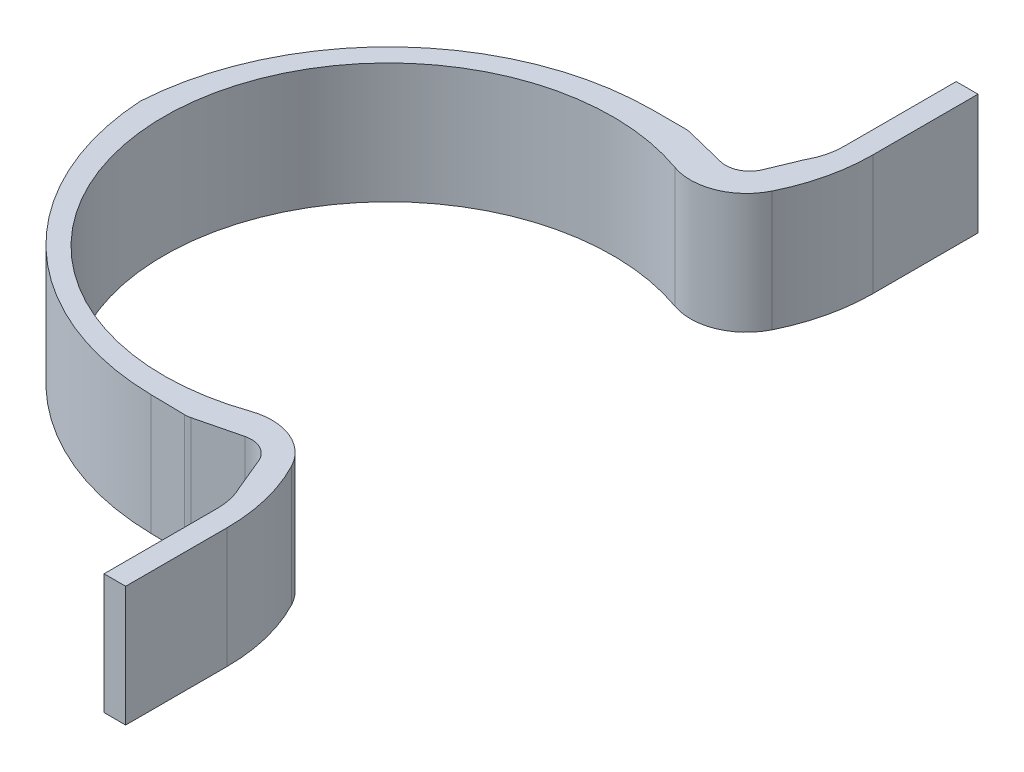
ISO-10303-21;
HEADER;
FILE_DESCRIPTION(('STEP AP214'),'2;1');
FILE_NAME('part.step','',(''),(''),'','','');
FILE_SCHEMA(('AUTOMOTIVE_DESIGN { 1 0 10303 214 1 1 1 1 }'));
ENDSEC;
DATA;
#1=APPLICATION_CONTEXT('core data for automotive mechanical design processes');
#2=APPLICATION_PROTOCOL_DEFINITION('international standard','automotive_design',2000,#1);
#3=PRODUCT_CONTEXT('',#1,'mechanical');
#4=PRODUCT('Part','Part','',(#3));
#5=PRODUCT_RELATED_PRODUCT_CATEGORY('part','',(#4));
#6=PRODUCT_DEFINITION_FORMATION('','',#4);
#7=PRODUCT_DEFINITION_CONTEXT('part definition',#1,'design');
#8=PRODUCT_DEFINITION('design','',#6,#7);
#9=PRODUCT_DEFINITION_SHAPE('','',#8);
#10=(LENGTH_UNIT() NAMED_UNIT(*) SI_UNIT(.MILLI.,.METRE.));
#11=(NAMED_UNIT(*) PLANE_ANGLE_UNIT() SI_UNIT($,.RADIAN.));
#12=(NAMED_UNIT(*) SI_UNIT($,.STERADIAN.) SOLID_ANGLE_UNIT());
#13=UNCERTAINTY_MEASURE_WITH_UNIT(LENGTH_MEASURE(1.E-05),#10,'distance_accuracy_value','');
#14=(GEOMETRIC_REPRESENTATION_CONTEXT(3) GLOBAL_UNCERTAINTY_ASSIGNED_CONTEXT((#13)) GLOBAL_UNIT_ASSIGNED_CONTEXT((#10,
#11,#12)) REPRESENTATION_CONTEXT('',''));
#15=CARTESIAN_POINT('',(0.,0.,0.));
#16=DIRECTION('',(0.,0.,1.));
#17=DIRECTION('',(1.,0.,0.));
#18=AXIS2_PLACEMENT_3D('',#15,#16,#17);
#19=CARTESIAN_POINT('',(-4.1408278836324,15.,-6.3209009215396));
#20=DIRECTION('',(0.,-1.,0.));
#21=DIRECTION('',(0.,0.,-1.));
#22=AXIS2_PLACEMENT_3D('',#19,#20,#21);
#23=CYLINDRICAL_SURFACE('',#22,28.);
#24=CARTESIAN_POINT('',(-4.1408278836324,15.,-6.3209009215396));
#25=DIRECTION('',(0.,1.,0.));
#26=DIRECTION('',(0.,0.,1.));
#27=AXIS2_PLACEMENT_3D('',#24,#25,#26);
#28=CIRCLE('',#27,28.);
#29=CARTESIAN_POINT('',(5.21689190636003,15.,-32.7109194954623));
#30=VERTEX_POINT('',#29);
#31=CARTESIAN_POINT('',(5.07458694263335,15.,20.1191469146471));
#32=VERTEX_POINT('',#31);
#33=EDGE_CURVE('E250',#30,#32,#28,.T.);
#34=ORIENTED_EDGE('',*,*,#33,.T.);
#35=DIRECTION('',(0.,-1.,0.));
#36=VECTOR('',#35,1.);
#37=CARTESIAN_POINT('',(5.07458694263335,15.,20.1191469146471));
#38=LINE('',#37,#36);
#39=CARTESIAN_POINT('',(5.07458694263335,0.,20.1191469146471));
#40=VERTEX_POINT('',#39);
#41=EDGE_CURVE('E67',#32,#40,#38,.T.);
#42=ORIENTED_EDGE('',*,*,#41,.T.);
#43=CARTESIAN_POINT('',(-4.1408278836324,0.,-6.3209009215396));
#44=DIRECTION('',(0.,1.,0.));
#45=DIRECTION('',(0.,0.,1.));
#46=AXIS2_PLACEMENT_3D('',#43,#44,#45);
#47=CIRCLE('',#46,28.);
#48=CARTESIAN_POINT('',(5.21689190636003,0.,-32.7109194954623));
#49=VERTEX_POINT('',#48);
#50=EDGE_CURVE('E278',#49,#40,#47,.T.);
#51=ORIENTED_EDGE('',*,*,#50,.F.);
#52=DIRECTION('',(0.,-1.,0.));
#53=VECTOR('',#52,1.);
#54=CARTESIAN_POINT('',(5.21689190636003,15.,-32.7109194954623));
#55=LINE('',#54,#53);
#56=EDGE_CURVE('E465',#49,#30,#55,.F.);
#57=ORIENTED_EDGE('',*,*,#56,.T.);
#58=EDGE_LOOP('',(#34,#42,#51,#57));
#59=FACE_BOUND('',#58,.T.);
#60=ADVANCED_FACE('F43',(#59),#23,.F.);
#61=CARTESIAN_POINT('',(16.2165948188573,15.,0.));
#62=DIRECTION('',(1.,0.,0.));
#63=DIRECTION('',(0.,0.,-1.));
#64=AXIS2_PLACEMENT_3D('',#61,#62,#63);
#65=PLANE('',#64);
#66=DIRECTION('',(0.,0.,1.));
#67=VECTOR('',#66,1.);
#68=CARTESIAN_POINT('',(16.2165948188573,15.,0.));
#69=LINE('',#68,#67);
#70=CARTESIAN_POINT('',(16.2165948188573,15.,-59.5259412203661));
#71=VERTEX_POINT('',#70);
#72=CARTESIAN_POINT('',(16.2165948188573,15.,-46.4057636800432));
#73=VERTEX_POINT('',#72);
#74=EDGE_CURVE('E229',#71,#73,#69,.T.);
#75=ORIENTED_EDGE('',*,*,#74,.T.);
#76=DIRECTION('',(0.,-1.,0.));
#77=VECTOR('',#76,1.);
#78=CARTESIAN_POINT('',(16.2165948188573,0.,-46.4057636800432));
#79=LINE('',#78,#77);
#80=CARTESIAN_POINT('',(16.2165948188573,0.,-46.4057636800432));
#81=VERTEX_POINT('',#80);
#82=EDGE_CURVE('E364',#73,#81,#79,.T.);
#83=ORIENTED_EDGE('',*,*,#82,.T.);
#84=DIRECTION('',(0.,0.,1.));
#85=VECTOR('',#84,1.);
#86=CARTESIAN_POINT('',(16.2165948188573,0.,0.));
#87=LINE('',#86,#85);
#88=CARTESIAN_POINT('',(16.2165948188573,0.,-59.5259412203661));
#89=VERTEX_POINT('',#88);
#90=EDGE_CURVE('E232',#89,#81,#87,.T.);
#91=ORIENTED_EDGE('',*,*,#90,.F.);
#92=DIRECTION('',(0.,-1.,0.));
#93=VECTOR('',#92,1.);
#94=CARTESIAN_POINT('',(16.2165948188573,15.,-59.5259412203661));
#95=LINE('',#94,#93);
#96=EDGE_CURVE('E226',#71,#89,#95,.T.);
#97=ORIENTED_EDGE('',*,*,#96,.F.);
#98=EDGE_LOOP('',(#75,#83,#91,#97));
#99=FACE_BOUND('',#98,.T.);
#100=ADVANCED_FACE('F228',(#99),#65,.T.);
#101=CARTESIAN_POINT('',(0.,15.,-59.5259412203661));
#102=DIRECTION('',(0.,0.,-1.));
#103=DIRECTION('',(-1.,0.,0.));
#104=AXIS2_PLACEMENT_3D('',#101,#102,#103);
#105=PLANE('',#104);
#106=DIRECTION('',(1.,0.,0.));
#107=VECTOR('',#106,1.);
#108=CARTESIAN_POINT('',(0.,0.,-59.5259412203661));
#109=LINE('',#108,#107);
#110=CARTESIAN_POINT('',(13.4971054403081,0.,-59.5259412203661));
#111=VERTEX_POINT('',#110);
#112=EDGE_CURVE('E284',#111,#89,#109,.T.);
#113=ORIENTED_EDGE('',*,*,#112,.F.);
#114=DIRECTION('',(0.,-1.,0.));
#115=VECTOR('',#114,1.);
#116=CARTESIAN_POINT('',(13.4971054403081,15.,-59.5259412203661));
#117=LINE('',#116,#115);
#118=CARTESIAN_POINT('',(13.4971054403081,15.,-59.5259412203661));
#119=VERTEX_POINT('',#118);
#120=EDGE_CURVE('E239',#119,#111,#117,.T.);
#121=ORIENTED_EDGE('',*,*,#120,.F.);
#122=DIRECTION('',(1.,0.,0.));
#123=VECTOR('',#122,1.);
#124=CARTESIAN_POINT('',(0.,15.,-59.5259412203661));
#125=LINE('',#124,#123);
#126=EDGE_CURVE('E246',#119,#71,#125,.T.);
#127=ORIENTED_EDGE('',*,*,#126,.T.);
#128=ORIENTED_EDGE('',*,*,#96,.T.);
#129=EDGE_LOOP('',(#113,#121,#127,#128));
#130=FACE_BOUND('',#129,.T.);
#131=ADVANCED_FACE('F254',(#130),#105,.T.);
#132=CARTESIAN_POINT('',(13.4971054403081,15.,0.));
#133=DIRECTION('',(-1.,0.,0.));
#134=DIRECTION('',(0.,0.,1.));
#135=AXIS2_PLACEMENT_3D('',#132,#133,#134);
#136=PLANE('',#135);
#137=CARTESIAN_POINT('',(13.4971054403081,7.42210730440718,-52.5898544294883));
#138=DIRECTION('',(-1.,0.,0.));
#139=DIRECTION('',(0.,0.,1.));
#140=AXIS2_PLACEMENT_3D('',#137,#138,#139);
#141=CIRCLE('',#140,3.00628595033639);
#142=CARTESIAN_POINT('',(13.4971054403081,7.42210730440718,-49.5835684791519));
#143=VERTEX_POINT('',#142);
#144=EDGE_CURVE('E604',#143,#143,#141,.T.);
#145=ORIENTED_EDGE('',*,*,#144,.F.);
#146=EDGE_LOOP('',(#145));
#147=FACE_BOUND('',#146,.T.);
#148=DIRECTION('',(0.,0.,-1.));
#149=VECTOR('',#148,1.);
#150=CARTESIAN_POINT('',(13.4971054403081,0.,0.));
#151=LINE('',#150,#149);
#152=CARTESIAN_POINT('',(13.4971054403081,0.,-45.5259412203661));
#153=VERTEX_POINT('',#152);
#154=EDGE_CURVE('E288',#153,#111,#151,.T.);
#155=ORIENTED_EDGE('',*,*,#154,.F.);
#156=DIRECTION('',(0.,-1.,0.));
#157=VECTOR('',#156,1.);
#158=CARTESIAN_POINT('',(13.4971054403081,15.,-45.5259412203661));
#159=LINE('',#158,#157);
#160=CARTESIAN_POINT('',(13.4971054403081,15.,-45.5259412203661));
#161=VERTEX_POINT('',#160);
#162=EDGE_CURVE('E334',#153,#161,#159,.F.);
#163=ORIENTED_EDGE('',*,*,#162,.T.);
#164=DIRECTION('',(0.,0.,-1.));
#165=VECTOR('',#164,1.);
#166=CARTESIAN_POINT('',(13.4971054403081,15.,0.));
#167=LINE('',#166,#165);
#168=EDGE_CURVE('E257',#161,#119,#167,.T.);
#169=ORIENTED_EDGE('',*,*,#168,.T.);
#170=ORIENTED_EDGE('',*,*,#120,.T.);
#171=EDGE_LOOP('',(#155,#163,#169,#170));
#172=FACE_BOUND('',#171,.T.);
#173=ADVANCED_FACE('F581',(#147,#172),#136,.T.);
#174=CARTESIAN_POINT('',(0.,15.,-37.5259412203661));
#175=DIRECTION('',(0.,0.,-1.));
#176=DIRECTION('',(-1.,0.,0.));
#177=AXIS2_PLACEMENT_3D('',#174,#175,#176);
#178=PLANE('',#177);
#179=DIRECTION('',(1.,0.,0.));
#180=VECTOR('',#179,1.);
#181=CARTESIAN_POINT('',(0.,15.,-37.5259412203661));
#182=LINE('',#181,#180);
#183=CARTESIAN_POINT('',(-2.34543573547922,15.,-37.5259412203661));
#184=VERTEX_POINT('',#183);
#185=CARTESIAN_POINT('',(1.65692417209445,15.,-37.5259412203661));
#186=VERTEX_POINT('',#185);
#187=EDGE_CURVE('E260',#184,#186,#182,.T.);
#188=ORIENTED_EDGE('',*,*,#187,.T.);
#189=DIRECTION('',(0.,1.,0.));
#190=VECTOR('',#189,1.);
#191=CARTESIAN_POINT('',(1.65692417209445,0.,-37.5259412203661));
#192=LINE('',#191,#190);
#193=CARTESIAN_POINT('',(1.65692417209445,0.,-37.5259412203661));
#194=VERTEX_POINT('',#193);
#195=EDGE_CURVE('E419',#186,#194,#192,.F.);
#196=ORIENTED_EDGE('',*,*,#195,.T.);
#197=DIRECTION('',(1.,0.,0.));
#198=VECTOR('',#197,1.);
#199=CARTESIAN_POINT('',(0.,0.,-37.5259412203661));
#200=LINE('',#199,#198);
#201=CARTESIAN_POINT('',(-2.34543573547922,0.,-37.5259412203661));
#202=VERTEX_POINT('',#201);
#203=EDGE_CURVE('E291',#202,#194,#200,.T.);
#204=ORIENTED_EDGE('',*,*,#203,.F.);
#205=DIRECTION('',(0.,-1.,0.));
#206=VECTOR('',#205,1.);
#207=CARTESIAN_POINT('',(-2.34543573547922,15.,-37.5259412203661));
#208=LINE('',#207,#206);
#209=EDGE_CURVE('E331',#202,#184,#208,.F.);
#210=ORIENTED_EDGE('',*,*,#209,.T.);
#211=EDGE_LOOP('',(#188,#196,#204,#210));
#212=FACE_BOUND('',#211,.T.);
#213=ADVANCED_FACE('F661',(#212),#178,.T.);
#214=CARTESIAN_POINT('',(-0.429152666859358,15.,24.5689901776984));
#215=DIRECTION('',(-0.0174645848472883,0.,0.999847482507263));
#216=DIRECTION('',(0.999847482507263,0.,0.0174645848472883));
#217=AXIS2_PLACEMENT_3D('',#214,#215,#216);
#218=PLANE('',#217);
#219=DIRECTION('',(-0.999847482507263,0.,-0.0174645848472883));
#220=VECTOR('',#219,1.);
#221=CARTESIAN_POINT('',(-0.429152666859358,0.,24.5689901776984));
#222=LINE('',#221,#220);
#223=CARTESIAN_POINT('',(1.32341544728098,0.,24.5996027211768));
#224=VERTEX_POINT('',#223);
#225=CARTESIAN_POINT('',(-2.92176703543973,0.,24.52545106209));
#226=VERTEX_POINT('',#225);
#227=EDGE_CURVE('E295',#224,#226,#222,.T.);
#228=ORIENTED_EDGE('',*,*,#227,.F.);
#229=DIRECTION('',(0.,1.,0.));
#230=VECTOR('',#229,1.);
#231=CARTESIAN_POINT('',(1.32341544728097,15.,24.5996027211768));
#232=LINE('',#231,#230);
#233=CARTESIAN_POINT('',(1.32341544728098,15.,24.5996027211768));
#234=VERTEX_POINT('',#233);
#235=EDGE_CURVE('E377',#224,#234,#232,.T.);
#236=ORIENTED_EDGE('',*,*,#235,.T.);
#237=DIRECTION('',(-0.999847482507263,0.,-0.0174645848472883));
#238=VECTOR('',#237,1.);
#239=CARTESIAN_POINT('',(-0.429152666859358,15.,24.5689901776984));
#240=LINE('',#239,#238);
#241=CARTESIAN_POINT('',(-2.92176703543973,15.,24.52545106209));
#242=VERTEX_POINT('',#241);
#243=EDGE_CURVE('E267',#234,#242,#240,.T.);
#244=ORIENTED_EDGE('',*,*,#243,.T.);
#245=DIRECTION('',(0.,-1.,0.));
#246=VECTOR('',#245,1.);
#247=CARTESIAN_POINT('',(-2.92176703543973,15.,24.52545106209));
#248=LINE('',#247,#246);
#249=EDGE_CURVE('E238',#242,#226,#248,.T.);
#250=ORIENTED_EDGE('',*,*,#249,.T.);
#251=EDGE_LOOP('',(#228,#236,#244,#250));
#252=FACE_BOUND('',#251,.T.);
#253=ADVANCED_FACE('F672',(#252),#218,.T.);
#254=CARTESIAN_POINT('',(13.5199069767111,15.,0.));
#255=DIRECTION('',(-1.,0.,0.));
#256=DIRECTION('',(0.,0.,1.));
#257=AXIS2_PLACEMENT_3D('',#254,#255,#256);
#258=PLANE('',#257);
#259=CARTESIAN_POINT('',(13.5199069767111,7.57416316152515,39.7316079405865));
#260=DIRECTION('',(-1.,0.,0.));
#261=DIRECTION('',(0.,0.,1.));
#262=AXIS2_PLACEMENT_3D('',#259,#260,#261);
#263=CIRCLE('',#262,2.99322586979157);
#264=CARTESIAN_POINT('',(13.5199069767111,7.57416316152515,42.7248338103781));
#265=VERTEX_POINT('',#264);
#266=EDGE_CURVE('E596',#265,#265,#263,.T.);
#267=ORIENTED_EDGE('',*,*,#266,.F.);
#268=EDGE_LOOP('',(#267));
#269=FACE_BOUND('',#268,.T.);
#270=DIRECTION('',(0.,0.,-1.));
#271=VECTOR('',#270,1.);
#272=CARTESIAN_POINT('',(13.5199069767111,15.,0.));
#273=LINE('',#272,#271);
#274=CARTESIAN_POINT('',(13.5199069767111,15.,46.8126418745293));
#275=VERTEX_POINT('',#274);
#276=CARTESIAN_POINT('',(13.5199069767111,15.,32.6741242093259));
#277=VERTEX_POINT('',#276);
#278=EDGE_CURVE('E270',#275,#277,#273,.T.);
#279=ORIENTED_EDGE('',*,*,#278,.T.);
#280=DIRECTION('',(0.,-1.,0.));
#281=VECTOR('',#280,1.);
#282=CARTESIAN_POINT('',(13.5199069767111,0.,32.6741242093259));
#283=LINE('',#282,#281);
#284=CARTESIAN_POINT('',(13.5199069767111,0.,32.6741242093259));
#285=VERTEX_POINT('',#284);
#286=EDGE_CURVE('E341',#277,#285,#283,.T.);
#287=ORIENTED_EDGE('',*,*,#286,.T.);
#288=DIRECTION('',(0.,0.,-1.));
#289=VECTOR('',#288,1.);
#290=CARTESIAN_POINT('',(13.5199069767111,0.,0.));
#291=LINE('',#290,#289);
#292=CARTESIAN_POINT('',(13.5199069767111,0.,46.8126418745293));
#293=VERTEX_POINT('',#292);
#294=EDGE_CURVE('E298',#293,#285,#291,.T.);
#295=ORIENTED_EDGE('',*,*,#294,.F.);
#296=DIRECTION('',(0.,-1.,0.));
#297=VECTOR('',#296,1.);
#298=CARTESIAN_POINT('',(13.5199069767111,15.,46.8126418745293));
#299=LINE('',#298,#297);
#300=EDGE_CURVE('E310',#275,#293,#299,.T.);
#301=ORIENTED_EDGE('',*,*,#300,.F.);
#302=EDGE_LOOP('',(#279,#287,#295,#301));
#303=FACE_BOUND('',#302,.T.);
#304=ADVANCED_FACE('F624',(#269,#303),#258,.T.);
#305=CARTESIAN_POINT('',(0.,15.,46.8126418745293));
#306=DIRECTION('',(0.,0.,1.));
#307=DIRECTION('',(1.,0.,0.));
#308=AXIS2_PLACEMENT_3D('',#305,#306,#307);
#309=PLANE('',#308);
#310=DIRECTION('',(-1.,0.,0.));
#311=VECTOR('',#310,1.);
#312=CARTESIAN_POINT('',(0.,0.,46.8126418745293));
#313=LINE('',#312,#311);
#314=CARTESIAN_POINT('',(16.2165948188573,0.,46.8126418745293));
#315=VERTEX_POINT('',#314);
#316=EDGE_CURVE('E302',#315,#293,#313,.T.);
#317=ORIENTED_EDGE('',*,*,#316,.F.);
#318=DIRECTION('',(0.,-1.,0.));
#319=VECTOR('',#318,1.);
#320=CARTESIAN_POINT('',(16.2165948188573,15.,46.8126418745293));
#321=LINE('',#320,#319);
#322=CARTESIAN_POINT('',(16.2165948188573,15.,46.8126418745293));
#323=VERTEX_POINT('',#322);
#324=EDGE_CURVE('E306',#323,#315,#321,.T.);
#325=ORIENTED_EDGE('',*,*,#324,.F.);
#326=DIRECTION('',(-1.,0.,0.));
#327=VECTOR('',#326,1.);
#328=CARTESIAN_POINT('',(0.,15.,46.8126418745293));
#329=LINE('',#328,#327);
#330=EDGE_CURVE('E274',#323,#275,#329,.T.);
#331=ORIENTED_EDGE('',*,*,#330,.T.);
#332=ORIENTED_EDGE('',*,*,#300,.T.);
#333=EDGE_LOOP('',(#317,#325,#331,#332));
#334=FACE_BOUND('',#333,.T.);
#335=ADVANCED_FACE('F620',(#334),#309,.T.);
#336=CARTESIAN_POINT('',(16.2165948188573,0.,34.1751056017875));
#337=VERTEX_POINT('',#336);
#338=EDGE_CURVE('E285',#337,#315,#87,.T.);
#339=ORIENTED_EDGE('',*,*,#338,.F.);
#340=DIRECTION('',(0.,-1.,0.));
#341=VECTOR('',#340,1.);
#342=CARTESIAN_POINT('',(16.2165948188573,15.,34.1751056017875));
#343=LINE('',#342,#341);
#344=CARTESIAN_POINT('',(16.2165948188573,15.,34.1751056017875));
#345=VERTEX_POINT('',#344);
#346=EDGE_CURVE('E374',#337,#345,#343,.F.);
#347=ORIENTED_EDGE('',*,*,#346,.T.);
#348=EDGE_CURVE('E252',#345,#323,#69,.T.);
#349=ORIENTED_EDGE('',*,*,#348,.T.);
#350=ORIENTED_EDGE('',*,*,#324,.T.);
#351=EDGE_LOOP('',(#339,#347,#349,#350));
#352=FACE_BOUND('',#351,.T.);
#353=ADVANCED_FACE('F505',(#352),#65,.T.);
#354=CARTESIAN_POINT('',(0.,15.,0.));
#355=DIRECTION('',(0.,1.,0.));
#356=DIRECTION('',(0.,0.,1.));
#357=AXIS2_PLACEMENT_3D('',#354,#355,#356);
#358=PLANE('',#357);
#359=CARTESIAN_POINT('',(-6.78340518114272,15.,34.1751056017875));
#360=DIRECTION('',(0.,1.,0.));
#361=DIRECTION('',(0.,0.,1.));
#362=AXIS2_PLACEMENT_3D('',#359,#360,#361);
#363=CIRCLE('',#362,23.);
#364=CARTESIAN_POINT('',(13.5742481999746,15.,23.4715571801528));
#365=VERTEX_POINT('',#364);
#366=EDGE_CURVE('E359',#345,#365,#363,.T.);
#367=ORIENTED_EDGE('',*,*,#366,.T.);
#368=CARTESIAN_POINT('',(7.37844064919979,15.,26.7291588736938));
#369=DIRECTION('',(0.,1.,0.));
#370=DIRECTION('',(0.,0.,1.));
#371=AXIS2_PLACEMENT_3D('',#368,#369,#370);
#372=CIRCLE('',#371,7.);
#373=EDGE_CURVE('E462',#365,#32,#372,.T.);
#374=ORIENTED_EDGE('',*,*,#373,.T.);
#375=ORIENTED_EDGE('',*,*,#33,.F.);
#376=CARTESIAN_POINT('',(7.55632185385814,15.,-39.3084241389429));
#377=DIRECTION('',(0.,1.,0.));
#378=DIRECTION('',(0.,0.,1.));
#379=AXIS2_PLACEMENT_3D('',#376,#377,#378);
#380=CIRCLE('',#379,7.);
#381=CARTESIAN_POINT('',(13.829952431671,15.,-36.2033380897116));
#382=VERTEX_POINT('',#381);
#383=EDGE_CURVE('E459',#30,#382,#380,.T.);
#384=ORIENTED_EDGE('',*,*,#383,.T.);
#385=CARTESIAN_POINT('',(-6.78340518114273,15.,-46.4057636800432));
#386=DIRECTION('',(0.,1.,0.));
#387=DIRECTION('',(0.,0.,1.));
#388=AXIS2_PLACEMENT_3D('',#385,#386,#387);
#389=CIRCLE('',#388,23.);
#390=EDGE_CURVE('E248',#382,#73,#389,.T.);
#391=ORIENTED_EDGE('',*,*,#390,.T.);
#392=ORIENTED_EDGE('',*,*,#74,.F.);
#393=ORIENTED_EDGE('',*,*,#126,.F.);
#394=ORIENTED_EDGE('',*,*,#168,.F.);
#395=CARTESIAN_POINT('',(5.49710544030813,15.,-45.5259412203661));
#396=DIRECTION('',(0.,1.,0.));
#397=DIRECTION('',(0.,0.,1.));
#398=AXIS2_PLACEMENT_3D('',#395,#396,#397);
#399=CIRCLE('',#398,8.);
#400=CARTESIAN_POINT('',(12.5345062544138,15.,-41.7213400873136));
#401=VERTEX_POINT('',#400);
#402=EDGE_CURVE('E348',#161,#401,#399,.F.);
#403=ORIENTED_EDGE('',*,*,#402,.T.);
#404=CARTESIAN_POINT('',(15.1735315597035,15.,-40.2946146624189));
#405=DIRECTION('',(0.,1.,0.));
#406=DIRECTION('',(0.,0.,1.));
#407=AXIS2_PLACEMENT_3D('',#404,#405,#406);
#408=CIRCLE('',#407,2.99999999999999);
#409=CARTESIAN_POINT('',(12.4029496350155,15.,-41.4452126802307));
#410=VERTEX_POINT('',#409);
#411=EDGE_CURVE('E384',#401,#410,#408,.T.);
#412=ORIENTED_EDGE('',*,*,#411,.T.);
#413=DIRECTION('',(0.383532672603916,0.,-0.923527308229322));
#414=VECTOR('',#413,1.);
#415=CARTESIAN_POINT('',(9.95952195146777,15.,-35.5615622049809));
#416=LINE('',#415,#414);
#417=CARTESIAN_POINT('',(10.9482966836019,15.,-37.9424818294116));
#418=VERTEX_POINT('',#417);
#419=EDGE_CURVE('E588',#418,#410,#416,.T.);
#420=ORIENTED_EDGE('',*,*,#419,.F.);
#421=CARTESIAN_POINT('',(8.17771475891397,15.,-39.0930798472234));
#422=DIRECTION('',(0.,1.,0.));
#423=DIRECTION('',(0.,0.,1.));
#424=AXIS2_PLACEMENT_3D('',#421,#422,#423);
#425=CIRCLE('',#424,2.99999999999999);
#426=CARTESIAN_POINT('',(7.45696022781075,15.,-36.1809478265392));
#427=VERTEX_POINT('',#426);
#428=EDGE_CURVE('E443',#418,#427,#425,.F.);
#429=ORIENTED_EDGE('',*,*,#428,.T.);
#430=DIRECTION('',(0.970710673561397,0.,0.240251510367739));
#431=VECTOR('',#430,1.);
#432=CARTESIAN_POINT('',(1.71570550206894,15.,-37.6019120302239));
#433=LINE('',#432,#431);
#434=CARTESIAN_POINT('',(2.37767870319766,15.,-37.4380732410503));
#435=VERTEX_POINT('',#434);
#436=EDGE_CURVE('E595',#435,#427,#433,.T.);
#437=ORIENTED_EDGE('',*,*,#436,.F.);
#438=CARTESIAN_POINT('',(1.65692417209445,15.,-34.5259412203661));
#439=DIRECTION('',(0.,1.,0.));
#440=DIRECTION('',(0.,0.,1.));
#441=AXIS2_PLACEMENT_3D('',#438,#439,#440);
#442=CIRCLE('',#441,2.99999999999999);
#443=EDGE_CURVE('E387',#435,#186,#442,.T.);
#444=ORIENTED_EDGE('',*,*,#443,.T.);
#445=ORIENTED_EDGE('',*,*,#187,.F.);
#446=CARTESIAN_POINT('',(-2.34543573547922,15.,-4.52594122036613));
#447=DIRECTION('',(0.,1.,0.));
#448=DIRECTION('',(0.,0.,1.));
#449=AXIS2_PLACEMENT_3D('',#446,#447,#448);
#450=CIRCLE('',#449,33.);
#451=CARTESIAN_POINT('',(-35.286474801728,15.,-6.4977285405079));
#452=VERTEX_POINT('',#451);
#453=EDGE_CURVE('E324',#184,#452,#450,.T.);
#454=ORIENTED_EDGE('',*,*,#453,.T.);
#455=CARTESIAN_POINT('',(-2.34543573547922,15.,-8.46951586064968));
#456=DIRECTION('',(0.,1.,0.));
#457=DIRECTION('',(0.,0.,1.));
#458=AXIS2_PLACEMENT_3D('',#455,#456,#457);
#459=CIRCLE('',#458,33.);
#460=EDGE_CURVE('E327',#452,#242,#459,.T.);
#461=ORIENTED_EDGE('',*,*,#460,.T.);
#462=ORIENTED_EDGE('',*,*,#243,.F.);
#463=CARTESIAN_POINT('',(1.37580920182284,15.,21.600060273655));
#464=DIRECTION('',(0.,1.,0.));
#465=DIRECTION('',(0.,0.,1.));
#466=AXIS2_PLACEMENT_3D('',#463,#464,#465);
#467=CIRCLE('',#466,2.99999999999999);
#468=CARTESIAN_POINT('',(2.09656373292605,15.,24.5121922943392));
#469=VERTEX_POINT('',#468);
#470=EDGE_CURVE('E390',#234,#469,#467,.T.);
#471=ORIENTED_EDGE('',*,*,#470,.T.);
#472=DIRECTION('',(-0.970710673561397,0.,0.240251510367738));
#473=VECTOR('',#472,1.);
#474=CARTESIAN_POINT('',(1.71570550206894,15.,24.6064549492081));
#475=LINE('',#474,#473);
#476=CARTESIAN_POINT('',(7.45696022781075,15.,23.1854907455234));
#477=VERTEX_POINT('',#476);
#478=EDGE_CURVE('E640',#477,#469,#475,.T.);
#479=ORIENTED_EDGE('',*,*,#478,.F.);
#480=CARTESIAN_POINT('',(8.17771475891397,15.,26.0976227662076));
#481=DIRECTION('',(0.,1.,0.));
#482=DIRECTION('',(0.,0.,1.));
#483=AXIS2_PLACEMENT_3D('',#480,#481,#482);
#484=CIRCLE('',#483,2.99999999999999);
#485=CARTESIAN_POINT('',(10.9482966836019,15.,24.9470247483958));
#486=VERTEX_POINT('',#485);
#487=EDGE_CURVE('E449',#477,#486,#484,.F.);
#488=ORIENTED_EDGE('',*,*,#487,.T.);
#489=DIRECTION('',(-0.383532672603916,0.,-0.923527308229322));
#490=VECTOR('',#489,1.);
#491=CARTESIAN_POINT('',(9.95952195146777,15.,22.5661051239651));
#492=LINE('',#491,#490);
#493=CARTESIAN_POINT('',(12.6132574940014,15.,28.9561663036539));
#494=VERTEX_POINT('',#493);
#495=EDGE_CURVE('E635',#494,#486,#492,.T.);
#496=ORIENTED_EDGE('',*,*,#495,.F.);
#497=CARTESIAN_POINT('',(15.3838394186894,15.,27.8055682858421));
#498=DIRECTION('',(0.,1.,0.));
#499=DIRECTION('',(0.,0.,1.));
#500=AXIS2_PLACEMENT_3D('',#497,#498,#499);
#501=CIRCLE('',#500,2.99999999999999);
#502=CARTESIAN_POINT('',(12.6936760254226,15.,29.1333562649741));
#503=VERTEX_POINT('',#502);
#504=EDGE_CURVE('E381',#494,#503,#501,.T.);
#505=ORIENTED_EDGE('',*,*,#504,.T.);
#506=CARTESIAN_POINT('',(5.51990697671113,15.,32.6741242093259));
#507=DIRECTION('',(0.,1.,0.));
#508=DIRECTION('',(0.,0.,1.));
#509=AXIS2_PLACEMENT_3D('',#506,#507,#508);
#510=CIRCLE('',#509,8.);
#511=EDGE_CURVE('E356',#503,#277,#510,.F.);
#512=ORIENTED_EDGE('',*,*,#511,.T.);
#513=ORIENTED_EDGE('',*,*,#278,.F.);
#514=ORIENTED_EDGE('',*,*,#330,.F.);
#515=ORIENTED_EDGE('',*,*,#348,.F.);
#516=EDGE_LOOP('',(#367,#374,#375,#384,#391,#392,#393,#394,#403,#412,#420,#429,#437,#444,#445,
#454,#461,#462,#471,#479,#488,#496,#505,#512,#513,#514,#515));
#517=FACE_BOUND('',#516,.T.);
#518=ADVANCED_FACE('F244',(#517),#358,.T.);
#519=CARTESIAN_POINT('',(0.,0.,0.));
#520=DIRECTION('',(0.,1.,0.));
#521=DIRECTION('',(0.,0.,1.));
#522=AXIS2_PLACEMENT_3D('',#519,#520,#521);
#523=PLANE('',#522);
#524=ORIENTED_EDGE('',*,*,#50,.T.);
#525=CARTESIAN_POINT('',(7.37844064919979,0.,26.7291588736938));
#526=DIRECTION('',(0.,1.,0.));
#527=DIRECTION('',(0.,0.,1.));
#528=AXIS2_PLACEMENT_3D('',#525,#526,#527);
#529=CIRCLE('',#528,7.);
#530=CARTESIAN_POINT('',(13.5742481999746,0.,23.4715571801528));
#531=VERTEX_POINT('',#530);
#532=EDGE_CURVE('E472',#40,#531,#529,.F.);
#533=ORIENTED_EDGE('',*,*,#532,.T.);
#534=CARTESIAN_POINT('',(-6.78340518114272,0.,34.1751056017875));
#535=DIRECTION('',(0.,1.,0.));
#536=DIRECTION('',(0.,0.,1.));
#537=AXIS2_PLACEMENT_3D('',#534,#535,#536);
#538=CIRCLE('',#537,23.);
#539=EDGE_CURVE('E367',#531,#337,#538,.F.);
#540=ORIENTED_EDGE('',*,*,#539,.T.);
#541=ORIENTED_EDGE('',*,*,#338,.T.);
#542=ORIENTED_EDGE('',*,*,#316,.T.);
#543=ORIENTED_EDGE('',*,*,#294,.T.);
#544=CARTESIAN_POINT('',(5.51990697671113,0.,32.6741242093259));
#545=DIRECTION('',(0.,1.,0.));
#546=DIRECTION('',(0.,0.,1.));
#547=AXIS2_PLACEMENT_3D('',#544,#545,#546);
#548=CIRCLE('',#547,8.);
#549=CARTESIAN_POINT('',(12.6936760254226,0.,29.1333562649741));
#550=VERTEX_POINT('',#549);
#551=EDGE_CURVE('E352',#285,#550,#548,.T.);
#552=ORIENTED_EDGE('',*,*,#551,.T.);
#553=CARTESIAN_POINT('',(15.3838394186894,0.,27.8055682858421));
#554=DIRECTION('',(0.,1.,0.));
#555=DIRECTION('',(0.,0.,1.));
#556=AXIS2_PLACEMENT_3D('',#553,#554,#555);
#557=CIRCLE('',#556,2.99999999999999);
#558=CARTESIAN_POINT('',(12.6132574940014,0.,28.9561663036539));
#559=VERTEX_POINT('',#558);
#560=EDGE_CURVE('E400',#550,#559,#557,.F.);
#561=ORIENTED_EDGE('',*,*,#560,.T.);
#562=DIRECTION('',(-0.383532672603916,0.,-0.923527308229322));
#563=VECTOR('',#562,1.);
#564=CARTESIAN_POINT('',(9.95952195146777,0.,22.5661051239651));
#565=LINE('',#564,#563);
#566=CARTESIAN_POINT('',(10.9482966836019,0.,24.9470247483958));
#567=VERTEX_POINT('',#566);
#568=EDGE_CURVE('E637',#559,#567,#565,.T.);
#569=ORIENTED_EDGE('',*,*,#568,.T.);
#570=CARTESIAN_POINT('',(8.17771475891397,0.,26.0976227662076));
#571=DIRECTION('',(0.,1.,0.));
#572=DIRECTION('',(0.,0.,1.));
#573=AXIS2_PLACEMENT_3D('',#570,#571,#572);
#574=CIRCLE('',#573,2.99999999999999);
#575=CARTESIAN_POINT('',(7.45696022781075,0.,23.1854907455234));
#576=VERTEX_POINT('',#575);
#577=EDGE_CURVE('E452',#567,#576,#574,.T.);
#578=ORIENTED_EDGE('',*,*,#577,.T.);
#579=DIRECTION('',(-0.970710673561397,0.,0.240251510367738));
#580=VECTOR('',#579,1.);
#581=CARTESIAN_POINT('',(1.71570550206894,0.,24.6064549492081));
#582=LINE('',#581,#580);
#583=CARTESIAN_POINT('',(2.09656373292605,0.,24.5121922943392));
#584=VERTEX_POINT('',#583);
#585=EDGE_CURVE('E338',#576,#584,#582,.T.);
#586=ORIENTED_EDGE('',*,*,#585,.T.);
#587=CARTESIAN_POINT('',(1.37580920182284,0.,21.600060273655));
#588=DIRECTION('',(0.,1.,0.));
#589=DIRECTION('',(0.,0.,1.));
#590=AXIS2_PLACEMENT_3D('',#587,#588,#589);
#591=CIRCLE('',#590,2.99999999999999);
#592=EDGE_CURVE('E409',#584,#224,#591,.F.);
#593=ORIENTED_EDGE('',*,*,#592,.T.);
#594=ORIENTED_EDGE('',*,*,#227,.T.);
#595=CARTESIAN_POINT('',(-2.34543573547922,0.,-8.46951586064968));
#596=DIRECTION('',(0.,1.,0.));
#597=DIRECTION('',(0.,0.,1.));
#598=AXIS2_PLACEMENT_3D('',#595,#596,#597);
#599=CIRCLE('',#598,33.);
#600=CARTESIAN_POINT('',(-35.286474801728,0.,-6.4977285405079));
#601=VERTEX_POINT('',#600);
#602=EDGE_CURVE('E321',#226,#601,#599,.F.);
#603=ORIENTED_EDGE('',*,*,#602,.T.);
#604=CARTESIAN_POINT('',(-2.34543573547922,0.,-4.52594122036613));
#605=DIRECTION('',(0.,1.,0.));
#606=DIRECTION('',(0.,0.,1.));
#607=AXIS2_PLACEMENT_3D('',#604,#605,#606);
#608=CIRCLE('',#607,33.);
#609=EDGE_CURVE('E318',#601,#202,#608,.F.);
#610=ORIENTED_EDGE('',*,*,#609,.T.);
#611=ORIENTED_EDGE('',*,*,#203,.T.);
#612=CARTESIAN_POINT('',(1.65692417209445,0.,-34.5259412203661));
#613=DIRECTION('',(0.,1.,0.));
#614=DIRECTION('',(0.,0.,1.));
#615=AXIS2_PLACEMENT_3D('',#612,#613,#614);
#616=CIRCLE('',#615,2.99999999999999);
#617=CARTESIAN_POINT('',(2.37767870319766,0.,-37.4380732410503));
#618=VERTEX_POINT('',#617);
#619=EDGE_CURVE('E406',#194,#618,#616,.F.);
#620=ORIENTED_EDGE('',*,*,#619,.T.);
#621=DIRECTION('',(0.970710673561397,0.,0.240251510367739));
#622=VECTOR('',#621,1.);
#623=CARTESIAN_POINT('',(1.71570550206894,0.,-37.6019120302239));
#624=LINE('',#623,#622);
#625=CARTESIAN_POINT('',(7.45696022781075,0.,-36.1809478265392));
#626=VERTEX_POINT('',#625);
#627=EDGE_CURVE('E607',#618,#626,#624,.T.);
#628=ORIENTED_EDGE('',*,*,#627,.T.);
#629=CARTESIAN_POINT('',(8.17771475891397,0.,-39.0930798472234));
#630=DIRECTION('',(0.,1.,0.));
#631=DIRECTION('',(0.,0.,1.));
#632=AXIS2_PLACEMENT_3D('',#629,#630,#631);
#633=CIRCLE('',#632,2.99999999999999);
#634=CARTESIAN_POINT('',(10.9482966836019,0.,-37.9424818294116));
#635=VERTEX_POINT('',#634);
#636=EDGE_CURVE('E446',#626,#635,#633,.T.);
#637=ORIENTED_EDGE('',*,*,#636,.T.);
#638=DIRECTION('',(0.383532672603916,0.,-0.923527308229322));
#639=VECTOR('',#638,1.);
#640=CARTESIAN_POINT('',(9.95952195146777,0.,-35.5615622049809));
#641=LINE('',#640,#639);
#642=CARTESIAN_POINT('',(12.4029496350155,0.,-41.4452126802307));
#643=VERTEX_POINT('',#642);
#644=EDGE_CURVE('E601',#635,#643,#641,.T.);
#645=ORIENTED_EDGE('',*,*,#644,.T.);
#646=CARTESIAN_POINT('',(15.1735315597035,0.,-40.2946146624189));
#647=DIRECTION('',(0.,1.,0.));
#648=DIRECTION('',(0.,0.,1.));
#649=AXIS2_PLACEMENT_3D('',#646,#647,#648);
#650=CIRCLE('',#649,2.99999999999999);
#651=CARTESIAN_POINT('',(12.5345062544138,0.,-41.7213400873136));
#652=VERTEX_POINT('',#651);
#653=EDGE_CURVE('E403',#643,#652,#650,.F.);
#654=ORIENTED_EDGE('',*,*,#653,.T.);
#655=CARTESIAN_POINT('',(5.49710544030813,0.,-45.5259412203661));
#656=DIRECTION('',(0.,1.,0.));
#657=DIRECTION('',(0.,0.,1.));
#658=AXIS2_PLACEMENT_3D('',#655,#656,#657);
#659=CIRCLE('',#658,8.);
#660=EDGE_CURVE('E345',#652,#153,#659,.T.);
#661=ORIENTED_EDGE('',*,*,#660,.T.);
#662=ORIENTED_EDGE('',*,*,#154,.T.);
#663=ORIENTED_EDGE('',*,*,#112,.T.);
#664=ORIENTED_EDGE('',*,*,#90,.T.);
#665=CARTESIAN_POINT('',(-6.78340518114273,0.,-46.4057636800432));
#666=DIRECTION('',(0.,1.,0.));
#667=DIRECTION('',(0.,0.,1.));
#668=AXIS2_PLACEMENT_3D('',#665,#666,#667);
#669=CIRCLE('',#668,23.);
#670=CARTESIAN_POINT('',(13.829952431671,0.,-36.2033380897116));
#671=VERTEX_POINT('',#670);
#672=EDGE_CURVE('E370',#81,#671,#669,.F.);
#673=ORIENTED_EDGE('',*,*,#672,.T.);
#674=CARTESIAN_POINT('',(7.55632185385814,0.,-39.3084241389429));
#675=DIRECTION('',(0.,1.,0.));
#676=DIRECTION('',(0.,0.,1.));
#677=AXIS2_PLACEMENT_3D('',#674,#675,#676);
#678=CIRCLE('',#677,7.);
#679=EDGE_CURVE('E59',#671,#49,#678,.F.);
#680=ORIENTED_EDGE('',*,*,#679,.T.);
#681=EDGE_LOOP('',(#524,#533,#540,#541,#542,#543,#552,#561,#569,#578,#586,#593,#594,#603,#610,
#611,#620,#628,#637,#645,#654,#661,#662,#663,#664,#673,#680));
#682=FACE_BOUND('',#681,.T.);
#683=ADVANCED_FACE('F517',(#682),#523,.F.);
#684=CARTESIAN_POINT('',(-2.34543573547922,15.,-4.52594122036613));
#685=DIRECTION('',(0.,-1.,0.));
#686=DIRECTION('',(0.,0.,-1.));
#687=AXIS2_PLACEMENT_3D('',#684,#685,#686);
#688=CYLINDRICAL_SURFACE('',#687,33.);
#689=DIRECTION('',(0.,-1.,0.));
#690=VECTOR('',#689,1.);
#691=CARTESIAN_POINT('',(-35.286474801728,7.5,-6.4977285405079));
#692=LINE('',#691,#690);
#693=EDGE_CURVE('E281',#452,#601,#692,.T.);
#694=ORIENTED_EDGE('',*,*,#693,.F.);
#695=ORIENTED_EDGE('',*,*,#453,.F.);
#696=ORIENTED_EDGE('',*,*,#209,.F.);
#697=ORIENTED_EDGE('',*,*,#609,.F.);
#698=EDGE_LOOP('',(#694,#695,#696,#697));
#699=FACE_BOUND('',#698,.T.);
#700=ADVANCED_FACE('F513',(#699),#688,.T.);
#701=CARTESIAN_POINT('',(-2.34543573547922,15.,-8.46951586064968));
#702=DIRECTION('',(0.,-1.,0.));
#703=DIRECTION('',(0.,0.,-1.));
#704=AXIS2_PLACEMENT_3D('',#701,#702,#703);
#705=CYLINDRICAL_SURFACE('',#704,33.);
#706=ORIENTED_EDGE('',*,*,#460,.F.);
#707=ORIENTED_EDGE('',*,*,#693,.T.);
#708=ORIENTED_EDGE('',*,*,#602,.F.);
#709=ORIENTED_EDGE('',*,*,#249,.F.);
#710=EDGE_LOOP('',(#706,#707,#708,#709));
#711=FACE_BOUND('',#710,.T.);
#712=ADVANCED_FACE('F509',(#711),#705,.T.);
#713=CARTESIAN_POINT('',(5.49710544030813,15.,-45.5259412203661));
#714=DIRECTION('',(0.,1.,0.));
#715=DIRECTION('',(0.,0.,1.));
#716=AXIS2_PLACEMENT_3D('',#713,#714,#715);
#717=CYLINDRICAL_SURFACE('',#716,8.);
#718=ORIENTED_EDGE('',*,*,#660,.F.);
#719=DIRECTION('',(0.,1.,0.));
#720=VECTOR('',#719,1.);
#721=CARTESIAN_POINT('',(12.5345062544138,15.,-41.7213400873136));
#722=LINE('',#721,#720);
#723=EDGE_CURVE('E422',#652,#401,#722,.T.);
#724=ORIENTED_EDGE('',*,*,#723,.T.);
#725=ORIENTED_EDGE('',*,*,#402,.F.);
#726=ORIENTED_EDGE('',*,*,#162,.F.);
#727=EDGE_LOOP('',(#718,#724,#725,#726));
#728=FACE_BOUND('',#727,.T.);
#729=ADVANCED_FACE('F512',(#728),#717,.F.);
#730=CARTESIAN_POINT('',(5.51990697671113,15.,32.6741242093259));
#731=DIRECTION('',(0.,1.,0.));
#732=DIRECTION('',(0.,0.,1.));
#733=AXIS2_PLACEMENT_3D('',#730,#731,#732);
#734=CYLINDRICAL_SURFACE('',#733,8.);
#735=ORIENTED_EDGE('',*,*,#511,.F.);
#736=DIRECTION('',(0.,1.,0.));
#737=VECTOR('',#736,1.);
#738=CARTESIAN_POINT('',(12.6936760254226,15.,29.1333562649741));
#739=LINE('',#738,#737);
#740=EDGE_CURVE('E433',#503,#550,#739,.F.);
#741=ORIENTED_EDGE('',*,*,#740,.T.);
#742=ORIENTED_EDGE('',*,*,#551,.F.);
#743=ORIENTED_EDGE('',*,*,#286,.F.);
#744=EDGE_LOOP('',(#735,#741,#742,#743));
#745=FACE_BOUND('',#744,.T.);
#746=ADVANCED_FACE('F521',(#745),#734,.F.);
#747=CARTESIAN_POINT('',(-6.78340518114273,0.,-46.4057636800432));
#748=DIRECTION('',(0.,1.,0.));
#749=DIRECTION('',(0.,0.,1.));
#750=AXIS2_PLACEMENT_3D('',#747,#748,#749);
#751=CYLINDRICAL_SURFACE('',#750,23.);
#752=ORIENTED_EDGE('',*,*,#390,.F.);
#753=DIRECTION('',(0.,1.,0.));
#754=VECTOR('',#753,1.);
#755=CARTESIAN_POINT('',(13.829952431671,0.,-36.2033380897116));
#756=LINE('',#755,#754);
#757=EDGE_CURVE('E475',#382,#671,#756,.F.);
#758=ORIENTED_EDGE('',*,*,#757,.T.);
#759=ORIENTED_EDGE('',*,*,#672,.F.);
#760=ORIENTED_EDGE('',*,*,#82,.F.);
#761=EDGE_LOOP('',(#752,#758,#759,#760));
#762=FACE_BOUND('',#761,.T.);
#763=ADVANCED_FACE('F525',(#762),#751,.T.);
#764=CARTESIAN_POINT('',(-6.78340518114272,0.,34.1751056017875));
#765=DIRECTION('',(0.,1.,0.));
#766=DIRECTION('',(0.,0.,1.));
#767=AXIS2_PLACEMENT_3D('',#764,#765,#766);
#768=CYLINDRICAL_SURFACE('',#767,23.);
#769=ORIENTED_EDGE('',*,*,#539,.F.);
#770=DIRECTION('',(0.,1.,0.));
#771=VECTOR('',#770,1.);
#772=CARTESIAN_POINT('',(13.5742481999746,0.,23.4715571801528));
#773=LINE('',#772,#771);
#774=EDGE_CURVE('E455',#531,#365,#773,.T.);
#775=ORIENTED_EDGE('',*,*,#774,.T.);
#776=ORIENTED_EDGE('',*,*,#366,.F.);
#777=ORIENTED_EDGE('',*,*,#346,.F.);
#778=EDGE_LOOP('',(#769,#775,#776,#777));
#779=FACE_BOUND('',#778,.T.);
#780=ADVANCED_FACE('F529',(#779),#768,.T.);
#781=CARTESIAN_POINT('',(9.95952195146777,0.,22.5661051239651));
#782=DIRECTION('',(0.923527308229322,0.,-0.383532672603916));
#783=DIRECTION('',(-0.383532672603916,0.,-0.923527308229322));
#784=AXIS2_PLACEMENT_3D('',#781,#782,#783);
#785=PLANE('',#784);
#786=ORIENTED_EDGE('',*,*,#568,.F.);
#787=DIRECTION('',(0.,1.,0.));
#788=VECTOR('',#787,1.);
#789=CARTESIAN_POINT('',(12.6132574940014,0.,28.9561663036539));
#790=LINE('',#789,#788);
#791=EDGE_CURVE('E440',#559,#494,#790,.T.);
#792=ORIENTED_EDGE('',*,*,#791,.T.);
#793=ORIENTED_EDGE('',*,*,#495,.T.);
#794=DIRECTION('',(0.,1.,0.));
#795=VECTOR('',#794,1.);
#796=CARTESIAN_POINT('',(10.9482966836019,0.,24.9470247483958));
#797=LINE('',#796,#795);
#798=EDGE_CURVE('E437',#486,#567,#797,.F.);
#799=ORIENTED_EDGE('',*,*,#798,.T.);
#800=EDGE_LOOP('',(#786,#792,#793,#799));
#801=FACE_BOUND('',#800,.T.);
#802=ADVANCED_FACE('F533',(#801),#785,.F.);
#803=CARTESIAN_POINT('',(1.71570550206894,0.,24.6064549492081));
#804=DIRECTION('',(-0.240251510367738,0.,-0.970710673561397));
#805=DIRECTION('',(-0.970710673561397,0.,0.240251510367738));
#806=AXIS2_PLACEMENT_3D('',#803,#804,#805);
#807=PLANE('',#806);
#808=ORIENTED_EDGE('',*,*,#478,.T.);
#809=DIRECTION('',(0.,1.,0.));
#810=VECTOR('',#809,1.);
#811=CARTESIAN_POINT('',(2.09656373292605,0.,24.5121922943392));
#812=LINE('',#811,#810);
#813=EDGE_CURVE('E397',#469,#584,#812,.F.);
#814=ORIENTED_EDGE('',*,*,#813,.T.);
#815=ORIENTED_EDGE('',*,*,#585,.F.);
#816=DIRECTION('',(0.,1.,0.));
#817=VECTOR('',#816,1.);
#818=CARTESIAN_POINT('',(7.45696022781075,15.,23.1854907455234));
#819=LINE('',#818,#817);
#820=EDGE_CURVE('E393',#576,#477,#819,.T.);
#821=ORIENTED_EDGE('',*,*,#820,.T.);
#822=EDGE_LOOP('',(#808,#814,#815,#821));
#823=FACE_BOUND('',#822,.T.);
#824=ADVANCED_FACE('F677',(#823),#807,.F.);
#825=CARTESIAN_POINT('',(9.95952195146777,0.,-35.5615622049809));
#826=DIRECTION('',(0.923527308229322,0.,0.383532672603916));
#827=DIRECTION('',(0.383532672603916,0.,-0.923527308229322));
#828=AXIS2_PLACEMENT_3D('',#825,#826,#827);
#829=PLANE('',#828);
#830=ORIENTED_EDGE('',*,*,#419,.T.);
#831=DIRECTION('',(0.,1.,0.));
#832=VECTOR('',#831,1.);
#833=CARTESIAN_POINT('',(12.4029496350155,0.,-41.4452126802307));
#834=LINE('',#833,#832);
#835=EDGE_CURVE('E430',#410,#643,#834,.F.);
#836=ORIENTED_EDGE('',*,*,#835,.T.);
#837=ORIENTED_EDGE('',*,*,#644,.F.);
#838=DIRECTION('',(0.,1.,0.));
#839=VECTOR('',#838,1.);
#840=CARTESIAN_POINT('',(10.9482966836019,15.,-37.9424818294116));
#841=LINE('',#840,#839);
#842=EDGE_CURVE('E426',#635,#418,#841,.T.);
#843=ORIENTED_EDGE('',*,*,#842,.T.);
#844=EDGE_LOOP('',(#830,#836,#837,#843));
#845=FACE_BOUND('',#844,.T.);
#846=ADVANCED_FACE('F590',(#845),#829,.F.);
#847=CARTESIAN_POINT('',(1.71570550206894,0.,-37.6019120302239));
#848=DIRECTION('',(-0.240251510367739,0.,0.970710673561397));
#849=DIRECTION('',(0.970710673561397,0.,0.240251510367739));
#850=AXIS2_PLACEMENT_3D('',#847,#848,#849);
#851=PLANE('',#850);
#852=ORIENTED_EDGE('',*,*,#627,.F.);
#853=DIRECTION('',(0.,1.,0.));
#854=VECTOR('',#853,1.);
#855=CARTESIAN_POINT('',(2.37767870319766,15.,-37.4380732410503));
#856=LINE('',#855,#854);
#857=EDGE_CURVE('E415',#618,#435,#856,.T.);
#858=ORIENTED_EDGE('',*,*,#857,.T.);
#859=ORIENTED_EDGE('',*,*,#436,.T.);
#860=DIRECTION('',(0.,1.,0.));
#861=VECTOR('',#860,1.);
#862=CARTESIAN_POINT('',(7.45696022781075,0.,-36.1809478265392));
#863=LINE('',#862,#861);
#864=EDGE_CURVE('E412',#427,#626,#863,.F.);
#865=ORIENTED_EDGE('',*,*,#864,.T.);
#866=EDGE_LOOP('',(#852,#858,#859,#865));
#867=FACE_BOUND('',#866,.T.);
#868=ADVANCED_FACE('F539',(#867),#851,.F.);
#869=CARTESIAN_POINT('',(1.37580920182284,15.,21.600060273655));
#870=DIRECTION('',(0.,-1.,0.));
#871=DIRECTION('',(0.,0.,-1.));
#872=AXIS2_PLACEMENT_3D('',#869,#870,#871);
#873=CYLINDRICAL_SURFACE('',#872,2.99999999999999);
#874=ORIENTED_EDGE('',*,*,#592,.F.);
#875=ORIENTED_EDGE('',*,*,#813,.F.);
#876=ORIENTED_EDGE('',*,*,#470,.F.);
#877=ORIENTED_EDGE('',*,*,#235,.F.);
#878=EDGE_LOOP('',(#874,#875,#876,#877));
#879=FACE_BOUND('',#878,.T.);
#880=ADVANCED_FACE('F535',(#879),#873,.T.);
#881=CARTESIAN_POINT('',(1.65692417209445,0.,-34.5259412203661));
#882=DIRECTION('',(0.,-1.,0.));
#883=DIRECTION('',(0.,0.,-1.));
#884=AXIS2_PLACEMENT_3D('',#881,#882,#883);
#885=CYLINDRICAL_SURFACE('',#884,2.99999999999999);
#886=ORIENTED_EDGE('',*,*,#619,.F.);
#887=ORIENTED_EDGE('',*,*,#195,.F.);
#888=ORIENTED_EDGE('',*,*,#443,.F.);
#889=ORIENTED_EDGE('',*,*,#857,.F.);
#890=EDGE_LOOP('',(#886,#887,#888,#889));
#891=FACE_BOUND('',#890,.T.);
#892=ADVANCED_FACE('F538',(#891),#885,.T.);
#893=CARTESIAN_POINT('',(15.1735315597035,15.,-40.2946146624189));
#894=DIRECTION('',(0.,1.,0.));
#895=DIRECTION('',(0.,0.,1.));
#896=AXIS2_PLACEMENT_3D('',#893,#894,#895);
#897=CYLINDRICAL_SURFACE('',#896,2.99999999999999);
#898=ORIENTED_EDGE('',*,*,#653,.F.);
#899=ORIENTED_EDGE('',*,*,#835,.F.);
#900=ORIENTED_EDGE('',*,*,#411,.F.);
#901=ORIENTED_EDGE('',*,*,#723,.F.);
#902=EDGE_LOOP('',(#898,#899,#900,#901));
#903=FACE_BOUND('',#902,.T.);
#904=ADVANCED_FACE('F543',(#903),#897,.T.);
#905=CARTESIAN_POINT('',(15.3838394186894,15.,27.8055682858421));
#906=DIRECTION('',(0.,1.,0.));
#907=DIRECTION('',(0.,0.,1.));
#908=AXIS2_PLACEMENT_3D('',#905,#906,#907);
#909=CYLINDRICAL_SURFACE('',#908,2.99999999999999);
#910=ORIENTED_EDGE('',*,*,#504,.F.);
#911=ORIENTED_EDGE('',*,*,#791,.F.);
#912=ORIENTED_EDGE('',*,*,#560,.F.);
#913=ORIENTED_EDGE('',*,*,#740,.F.);
#914=EDGE_LOOP('',(#910,#911,#912,#913));
#915=FACE_BOUND('',#914,.T.);
#916=ADVANCED_FACE('F547',(#915),#909,.T.);
#917=CARTESIAN_POINT('',(8.17771475891397,0.,-39.0930798472234));
#918=DIRECTION('',(0.,-1.,0.));
#919=DIRECTION('',(0.,0.,-1.));
#920=AXIS2_PLACEMENT_3D('',#917,#918,#919);
#921=CYLINDRICAL_SURFACE('',#920,2.99999999999999);
#922=ORIENTED_EDGE('',*,*,#636,.F.);
#923=ORIENTED_EDGE('',*,*,#864,.F.);
#924=ORIENTED_EDGE('',*,*,#428,.F.);
#925=ORIENTED_EDGE('',*,*,#842,.F.);
#926=EDGE_LOOP('',(#922,#923,#924,#925));
#927=FACE_BOUND('',#926,.T.);
#928=ADVANCED_FACE('F551',(#927),#921,.F.);
#929=CARTESIAN_POINT('',(8.17771475891397,0.,26.0976227662076));
#930=DIRECTION('',(0.,-1.,0.));
#931=DIRECTION('',(0.,0.,-1.));
#932=AXIS2_PLACEMENT_3D('',#929,#930,#931);
#933=CYLINDRICAL_SURFACE('',#932,2.99999999999999);
#934=ORIENTED_EDGE('',*,*,#577,.F.);
#935=ORIENTED_EDGE('',*,*,#798,.F.);
#936=ORIENTED_EDGE('',*,*,#487,.F.);
#937=ORIENTED_EDGE('',*,*,#820,.F.);
#938=EDGE_LOOP('',(#934,#935,#936,#937));
#939=FACE_BOUND('',#938,.T.);
#940=ADVANCED_FACE('F555',(#939),#933,.F.);
#941=CARTESIAN_POINT('',(7.37844064919979,15.,26.7291588736938));
#942=DIRECTION('',(0.,-1.,0.));
#943=DIRECTION('',(0.,0.,-1.));
#944=AXIS2_PLACEMENT_3D('',#941,#942,#943);
#945=CYLINDRICAL_SURFACE('',#944,7.);
#946=ORIENTED_EDGE('',*,*,#532,.F.);
#947=ORIENTED_EDGE('',*,*,#41,.F.);
#948=ORIENTED_EDGE('',*,*,#373,.F.);
#949=ORIENTED_EDGE('',*,*,#774,.F.);
#950=EDGE_LOOP('',(#946,#947,#948,#949));
#951=FACE_BOUND('',#950,.T.);
#952=ADVANCED_FACE('F559',(#951),#945,.T.);
#953=CARTESIAN_POINT('',(7.55632185385814,15.,-39.3084241389429));
#954=DIRECTION('',(0.,1.,0.));
#955=DIRECTION('',(0.,0.,1.));
#956=AXIS2_PLACEMENT_3D('',#953,#954,#955);
#957=CYLINDRICAL_SURFACE('',#956,7.);
#958=ORIENTED_EDGE('',*,*,#383,.F.);
#959=ORIENTED_EDGE('',*,*,#56,.F.);
#960=ORIENTED_EDGE('',*,*,#679,.F.);
#961=ORIENTED_EDGE('',*,*,#757,.F.);
#962=EDGE_LOOP('',(#958,#959,#960,#961));
#963=FACE_BOUND('',#962,.T.);
#964=ADVANCED_FACE('F563',(#963),#957,.T.);
#965=CARTESIAN_POINT('',(10.5199069767111,7.57416316152515,39.7316079405865));
#966=DIRECTION('',(1.,0.,0.));
#967=DIRECTION('',(0.,0.,-1.));
#968=AXIS2_PLACEMENT_3D('',#965,#966,#967);
#969=CYLINDRICAL_SURFACE('',#968,2.99322586979157);
#970=CARTESIAN_POINT('',(12.5199069767111,7.57416316152515,39.7316079405865));
#971=DIRECTION('',(-1.,0.,0.));
#972=DIRECTION('',(0.,0.,1.));
#973=AXIS2_PLACEMENT_3D('',#970,#971,#972);
#974=CIRCLE('',#973,2.99322586979157);
#975=CARTESIAN_POINT('',(12.5199069767111,7.57416316152515,42.7248338103781));
#976=VERTEX_POINT('',#975);
#977=EDGE_CURVE('E482',#976,#976,#974,.F.);
#978=ORIENTED_EDGE('',*,*,#977,.T.);
#979=EDGE_LOOP('',(#978));
#980=FACE_BOUND('',#979,.T.);
#981=ORIENTED_EDGE('',*,*,#266,.T.);
#982=EDGE_LOOP('',(#981));
#983=FACE_BOUND('',#982,.T.);
#984=ADVANCED_FACE('F566',(#980,#983),#969,.T.);
#985=CARTESIAN_POINT('',(10.5199069767111,7.57416316152515,39.7316079405865));
#986=DIRECTION('',(-1.,0.,0.));
#987=DIRECTION('',(0.,0.,1.));
#988=AXIS2_PLACEMENT_3D('',#985,#986,#987);
#989=PLANE('',#988);
#990=CARTESIAN_POINT('',(10.5199069767111,7.57416316152515,39.7316079405865));
#991=DIRECTION('',(-1.,0.,0.));
#992=DIRECTION('',(0.,0.,1.));
#993=AXIS2_PLACEMENT_3D('',#990,#991,#992);
#994=CIRCLE('',#993,0.993225869791565);
#995=CARTESIAN_POINT('',(10.5199069767111,7.57416316152515,40.7248338103781));
#996=VERTEX_POINT('',#995);
#997=EDGE_CURVE('E478',#996,#996,#994,.T.);
#998=ORIENTED_EDGE('',*,*,#997,.T.);
#999=EDGE_LOOP('',(#998));
#1000=FACE_BOUND('',#999,.T.);
#1001=ADVANCED_FACE('F570',(#1000),#989,.T.);
#1002=CARTESIAN_POINT('',(10.4971054403081,7.42210730440718,-52.5898544294883));
#1003=DIRECTION('',(1.,0.,0.));
#1004=DIRECTION('',(0.,0.,-1.));
#1005=AXIS2_PLACEMENT_3D('',#1002,#1003,#1004);
#1006=CYLINDRICAL_SURFACE('',#1005,3.00628595033639);
#1007=CARTESIAN_POINT('',(12.4971054403081,7.42210730440718,-52.5898544294883));
#1008=DIRECTION('',(-1.,0.,0.));
#1009=DIRECTION('',(0.,0.,1.));
#1010=AXIS2_PLACEMENT_3D('',#1007,#1008,#1009);
#1011=CIRCLE('',#1010,3.00628595033639);
#1012=CARTESIAN_POINT('',(12.4971054403081,7.42210730440718,-49.5835684791519));
#1013=VERTEX_POINT('',#1012);
#1014=EDGE_CURVE('E12',#1013,#1013,#1011,.F.);
#1015=ORIENTED_EDGE('',*,*,#1014,.T.);
#1016=EDGE_LOOP('',(#1015));
#1017=FACE_BOUND('',#1016,.T.);
#1018=ORIENTED_EDGE('',*,*,#144,.T.);
#1019=EDGE_LOOP('',(#1018));
#1020=FACE_BOUND('',#1019,.T.);
#1021=ADVANCED_FACE('F689',(#1017,#1020),#1006,.T.);
#1022=CARTESIAN_POINT('',(10.4971054403081,7.42210730440718,-52.5898544294883));
#1023=DIRECTION('',(-1.,0.,0.));
#1024=DIRECTION('',(0.,0.,1.));
#1025=AXIS2_PLACEMENT_3D('',#1022,#1023,#1024);
#1026=PLANE('',#1025);
#1027=CARTESIAN_POINT('',(10.4971054403081,7.42210730440718,-52.5898544294883));
#1028=DIRECTION('',(-1.,0.,0.));
#1029=DIRECTION('',(0.,0.,1.));
#1030=AXIS2_PLACEMENT_3D('',#1027,#1028,#1029);
#1031=CIRCLE('',#1030,1.00628595033639);
#1032=CARTESIAN_POINT('',(10.4971054403081,7.42210730440718,-51.5835684791519));
#1033=VERTEX_POINT('',#1032);
#1034=EDGE_CURVE('E52',#1033,#1033,#1031,.T.);
#1035=ORIENTED_EDGE('',*,*,#1034,.T.);
#1036=EDGE_LOOP('',(#1035));
#1037=FACE_BOUND('',#1036,.T.);
#1038=ADVANCED_FACE('F489',(#1037),#1026,.T.);
#1039=CARTESIAN_POINT('',(12.5199069767111,7.57416316152515,39.7316079405865));
#1040=DIRECTION('',(-1.,0.,0.));
#1041=DIRECTION('',(0.,0.,1.));
#1042=AXIS2_PLACEMENT_3D('',#1039,#1040,#1041);
#1043=DEGENERATE_TOROIDAL_SURFACE('',#1042,0.993225869791565,2.,.T.);
#1044=ORIENTED_EDGE('',*,*,#977,.F.);
#1045=EDGE_LOOP('',(#1044));
#1046=FACE_BOUND('',#1045,.T.);
#1047=ORIENTED_EDGE('',*,*,#997,.F.);
#1048=EDGE_LOOP('',(#1047));
#1049=FACE_BOUND('',#1048,.T.);
#1050=ADVANCED_FACE('F492',(#1046,#1049),#1043,.T.);
#1051=CARTESIAN_POINT('',(12.4971054403081,7.42210730440718,-52.5898544294883));
#1052=DIRECTION('',(-1.,0.,0.));
#1053=DIRECTION('',(0.,0.,1.));
#1054=AXIS2_PLACEMENT_3D('',#1051,#1052,#1053);
#1055=DEGENERATE_TOROIDAL_SURFACE('',#1054,1.00628595033639,2.,.T.);
#1056=ORIENTED_EDGE('',*,*,#1014,.F.);
#1057=EDGE_LOOP('',(#1056));
#1058=FACE_BOUND('',#1057,.T.);
#1059=ORIENTED_EDGE('',*,*,#1034,.F.);
#1060=EDGE_LOOP('',(#1059));
#1061=FACE_BOUND('',#1060,.T.);
#1062=ADVANCED_FACE('F45',(#1058,#1061),#1055,.T.);
#1063=CLOSED_SHELL('',(#60,#100,#131,#173,#213,#253,#304,#335,#353,#518,#683,#700,#712,#729,
#746,#763,#780,#802,#824,#846,#868,#880,#892,#904,#916,#928,#940,#952,#964,#984,#1001,#1021,
#1038,#1050,#1062));
#1064=MANIFOLD_SOLID_BREP('B2',#1063);
#1065=ADVANCED_BREP_SHAPE_REPRESENTATION('',(#18,#1064),#14);
#1066=SHAPE_DEFINITION_REPRESENTATION(#9,#1065);
ENDSEC;
END-ISO-10303-21;
